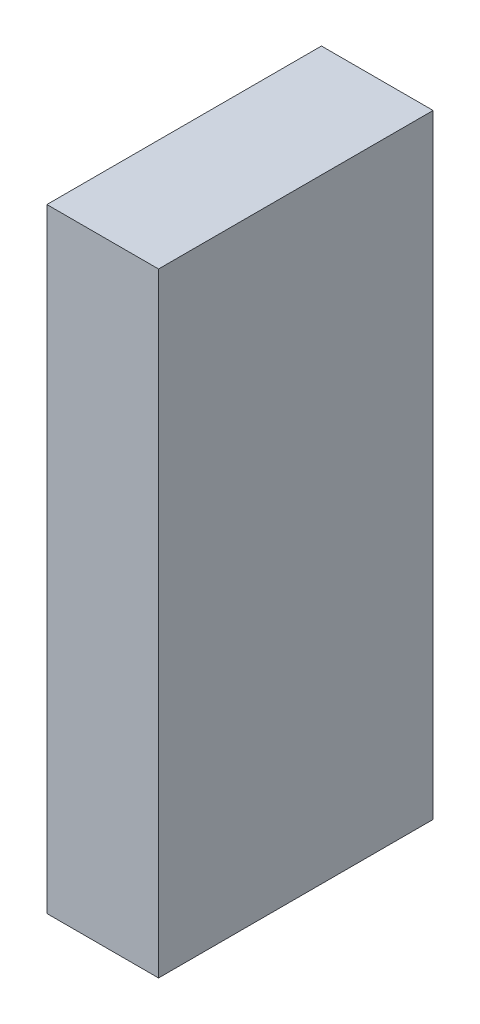
ISO-10303-21;
HEADER;
FILE_DESCRIPTION(('STEP AP214'),'2;1');
FILE_NAME('part.step','',(''),(''),'','','');
FILE_SCHEMA(('AUTOMOTIVE_DESIGN { 1 0 10303 214 1 1 1 1 }'));
ENDSEC;
DATA;
#1=APPLICATION_CONTEXT('core data for automotive mechanical design processes');
#2=APPLICATION_PROTOCOL_DEFINITION('international standard','automotive_design',2000,#1);
#3=PRODUCT_CONTEXT('',#1,'mechanical');
#4=PRODUCT('Part','Part','',(#3));
#5=PRODUCT_RELATED_PRODUCT_CATEGORY('part','',(#4));
#6=PRODUCT_DEFINITION_FORMATION('','',#4);
#7=PRODUCT_DEFINITION_CONTEXT('part definition',#1,'design');
#8=PRODUCT_DEFINITION('design','',#6,#7);
#9=PRODUCT_DEFINITION_SHAPE('','',#8);
#10=(LENGTH_UNIT() NAMED_UNIT(*) SI_UNIT(.MILLI.,.METRE.));
#11=(NAMED_UNIT(*) PLANE_ANGLE_UNIT() SI_UNIT($,.RADIAN.));
#12=(NAMED_UNIT(*) SI_UNIT($,.STERADIAN.) SOLID_ANGLE_UNIT());
#13=UNCERTAINTY_MEASURE_WITH_UNIT(LENGTH_MEASURE(1.E-05),#10,'distance_accuracy_value','');
#14=(GEOMETRIC_REPRESENTATION_CONTEXT(3) GLOBAL_UNCERTAINTY_ASSIGNED_CONTEXT((#13)) GLOBAL_UNIT_ASSIGNED_CONTEXT((#10,
#11,#12)) REPRESENTATION_CONTEXT('',''));
#15=CARTESIAN_POINT('',(0.,0.,0.));
#16=DIRECTION('',(0.,0.,1.));
#17=DIRECTION('',(1.,0.,0.));
#18=AXIS2_PLACEMENT_3D('',#15,#16,#17);
#19=CARTESIAN_POINT('',(11.5459925071872,127.,28.3937162676747));
#20=DIRECTION('',(-1.,0.,0.));
#21=DIRECTION('',(0.,0.,1.));
#22=AXIS2_PLACEMENT_3D('',#19,#20,#21);
#23=PLANE('',#22);
#24=DIRECTION('',(0.,0.,-1.));
#25=VECTOR('',#24,1.);
#26=CARTESIAN_POINT('',(11.5459925071872,0.,28.3937162676747));
#27=LINE('',#26,#25);
#28=CARTESIAN_POINT('',(11.5459925071872,0.,28.3937162676747));
#29=VERTEX_POINT('',#28);
#30=CARTESIAN_POINT('',(11.5459925071872,0.,-28.3937162676747));
#31=VERTEX_POINT('',#30);
#32=EDGE_CURVE('E95',#29,#31,#27,.T.);
#33=ORIENTED_EDGE('',*,*,#32,.T.);
#34=DIRECTION('',(0.,-1.,0.));
#35=VECTOR('',#34,1.);
#36=CARTESIAN_POINT('',(11.5459925071872,127.,-28.3937162676747));
#37=LINE('',#36,#35);
#38=CARTESIAN_POINT('',(11.5459925071872,127.,-28.3937162676747));
#39=VERTEX_POINT('',#38);
#40=EDGE_CURVE('E11',#39,#31,#37,.T.);
#41=ORIENTED_EDGE('',*,*,#40,.F.);
#42=DIRECTION('',(0.,0.,-1.));
#43=VECTOR('',#42,1.);
#44=CARTESIAN_POINT('',(11.5459925071872,127.,28.3937162676747));
#45=LINE('',#44,#43);
#46=CARTESIAN_POINT('',(11.5459925071872,127.,28.3937162676747));
#47=VERTEX_POINT('',#46);
#48=EDGE_CURVE('E83',#47,#39,#45,.T.);
#49=ORIENTED_EDGE('',*,*,#48,.F.);
#50=DIRECTION('',(0.,-1.,0.));
#51=VECTOR('',#50,1.);
#52=CARTESIAN_POINT('',(11.5459925071872,127.,28.3937162676747));
#53=LINE('',#52,#51);
#54=EDGE_CURVE('E91',#47,#29,#53,.T.);
#55=ORIENTED_EDGE('',*,*,#54,.T.);
#56=EDGE_LOOP('',(#33,#41,#49,#55));
#57=FACE_BOUND('',#56,.T.);
#58=ADVANCED_FACE('F32',(#57),#23,.F.);
#59=CARTESIAN_POINT('',(-11.5459925071872,127.,-28.3937162676747));
#60=DIRECTION('',(0.,0.,1.));
#61=DIRECTION('',(1.,0.,0.));
#62=AXIS2_PLACEMENT_3D('',#59,#60,#61);
#63=PLANE('',#62);
#64=DIRECTION('',(-1.,0.,0.));
#65=VECTOR('',#64,1.);
#66=CARTESIAN_POINT('',(-11.5459925071872,0.,-28.3937162676747));
#67=LINE('',#66,#65);
#68=CARTESIAN_POINT('',(-11.5459925071872,0.,-28.3937162676747));
#69=VERTEX_POINT('',#68);
#70=EDGE_CURVE('E87',#31,#69,#67,.T.);
#71=ORIENTED_EDGE('',*,*,#70,.T.);
#72=DIRECTION('',(0.,-1.,0.));
#73=VECTOR('',#72,1.);
#74=CARTESIAN_POINT('',(-11.5459925071872,127.,-28.3937162676747));
#75=LINE('',#74,#73);
#76=CARTESIAN_POINT('',(-11.5459925071872,127.,-28.3937162676747));
#77=VERTEX_POINT('',#76);
#78=EDGE_CURVE('E40',#77,#69,#75,.T.);
#79=ORIENTED_EDGE('',*,*,#78,.F.);
#80=DIRECTION('',(-1.,0.,0.));
#81=VECTOR('',#80,1.);
#82=CARTESIAN_POINT('',(-11.5459925071872,127.,-28.3937162676747));
#83=LINE('',#82,#81);
#84=EDGE_CURVE('E78',#39,#77,#83,.T.);
#85=ORIENTED_EDGE('',*,*,#84,.F.);
#86=ORIENTED_EDGE('',*,*,#40,.T.);
#87=EDGE_LOOP('',(#71,#79,#85,#86));
#88=FACE_BOUND('',#87,.T.);
#89=ADVANCED_FACE('F86',(#88),#63,.F.);
#90=CARTESIAN_POINT('',(-11.5459925071872,127.,28.3937162676747));
#91=DIRECTION('',(1.,0.,0.));
#92=DIRECTION('',(0.,0.,-1.));
#93=AXIS2_PLACEMENT_3D('',#90,#91,#92);
#94=PLANE('',#93);
#95=DIRECTION('',(0.,0.,1.));
#96=VECTOR('',#95,1.);
#97=CARTESIAN_POINT('',(-11.5459925071872,0.,28.3937162676747));
#98=LINE('',#97,#96);
#99=CARTESIAN_POINT('',(-11.5459925071872,0.,28.3937162676747));
#100=VERTEX_POINT('',#99);
#101=EDGE_CURVE('E65',#69,#100,#98,.T.);
#102=ORIENTED_EDGE('',*,*,#101,.T.);
#103=DIRECTION('',(0.,-1.,0.));
#104=VECTOR('',#103,1.);
#105=CARTESIAN_POINT('',(-11.5459925071872,127.,28.3937162676747));
#106=LINE('',#105,#104);
#107=CARTESIAN_POINT('',(-11.5459925071872,127.,28.3937162676747));
#108=VERTEX_POINT('',#107);
#109=EDGE_CURVE('E88',#108,#100,#106,.T.);
#110=ORIENTED_EDGE('',*,*,#109,.F.);
#111=DIRECTION('',(0.,0.,1.));
#112=VECTOR('',#111,1.);
#113=CARTESIAN_POINT('',(-11.5459925071872,127.,28.3937162676747));
#114=LINE('',#113,#112);
#115=EDGE_CURVE('E81',#77,#108,#114,.T.);
#116=ORIENTED_EDGE('',*,*,#115,.F.);
#117=ORIENTED_EDGE('',*,*,#78,.T.);
#118=EDGE_LOOP('',(#102,#110,#116,#117));
#119=FACE_BOUND('',#118,.T.);
#120=ADVANCED_FACE('F89',(#119),#94,.F.);
#121=CARTESIAN_POINT('',(-11.5459925071872,127.,28.3937162676747));
#122=DIRECTION('',(0.,0.,-1.));
#123=DIRECTION('',(-1.,0.,0.));
#124=AXIS2_PLACEMENT_3D('',#121,#122,#123);
#125=PLANE('',#124);
#126=DIRECTION('',(1.,0.,0.));
#127=VECTOR('',#126,1.);
#128=CARTESIAN_POINT('',(-11.5459925071872,0.,28.3937162676747));
#129=LINE('',#128,#127);
#130=EDGE_CURVE('E71',#100,#29,#129,.T.);
#131=ORIENTED_EDGE('',*,*,#130,.T.);
#132=ORIENTED_EDGE('',*,*,#54,.F.);
#133=DIRECTION('',(1.,0.,0.));
#134=VECTOR('',#133,1.);
#135=CARTESIAN_POINT('',(-11.5459925071872,127.,28.3937162676747));
#136=LINE('',#135,#134);
#137=EDGE_CURVE('E48',#108,#47,#136,.T.);
#138=ORIENTED_EDGE('',*,*,#137,.F.);
#139=ORIENTED_EDGE('',*,*,#109,.T.);
#140=EDGE_LOOP('',(#131,#132,#138,#139));
#141=FACE_BOUND('',#140,.T.);
#142=ADVANCED_FACE('F102',(#141),#125,.F.);
#143=CARTESIAN_POINT('',(0.,127.,0.));
#144=DIRECTION('',(0.,-1.,0.));
#145=DIRECTION('',(0.,0.,-1.));
#146=AXIS2_PLACEMENT_3D('',#143,#144,#145);
#147=PLANE('',#146);
#148=ORIENTED_EDGE('',*,*,#48,.T.);
#149=ORIENTED_EDGE('',*,*,#84,.T.);
#150=ORIENTED_EDGE('',*,*,#115,.T.);
#151=ORIENTED_EDGE('',*,*,#137,.T.);
#152=EDGE_LOOP('',(#148,#149,#150,#151));
#153=FACE_BOUND('',#152,.T.);
#154=ADVANCED_FACE('F79',(#153),#147,.F.);
#155=CARTESIAN_POINT('',(0.,0.,0.));
#156=DIRECTION('',(0.,-1.,0.));
#157=DIRECTION('',(0.,0.,-1.));
#158=AXIS2_PLACEMENT_3D('',#155,#156,#157);
#159=PLANE('',#158);
#160=ORIENTED_EDGE('',*,*,#32,.F.);
#161=ORIENTED_EDGE('',*,*,#130,.F.);
#162=ORIENTED_EDGE('',*,*,#101,.F.);
#163=ORIENTED_EDGE('',*,*,#70,.F.);
#164=EDGE_LOOP('',(#160,#161,#162,#163));
#165=FACE_BOUND('',#164,.T.);
#166=ADVANCED_FACE('F105',(#165),#159,.T.);
#167=CLOSED_SHELL('',(#58,#89,#120,#142,#154,#166));
#168=MANIFOLD_SOLID_BREP('B2',#167);
#169=ADVANCED_BREP_SHAPE_REPRESENTATION('',(#18,#168),#14);
#170=SHAPE_DEFINITION_REPRESENTATION(#9,#169);
ENDSEC;
END-ISO-10303-21;
